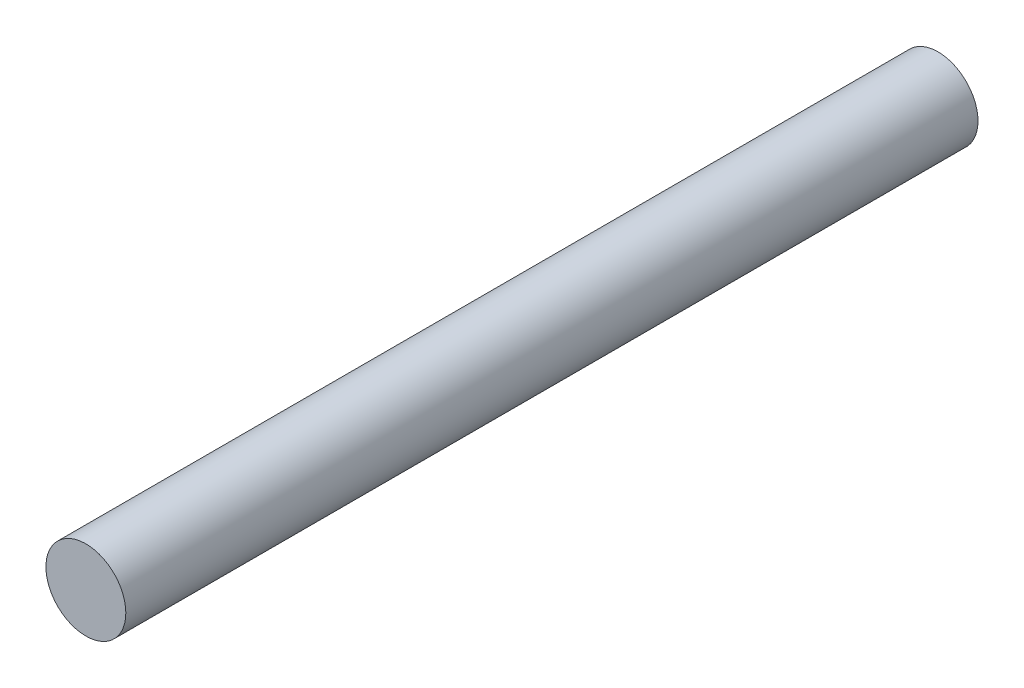
ISO-10303-21;
HEADER;
FILE_DESCRIPTION(('STEP AP214'),'2;1');
FILE_NAME('part.step','',(''),(''),'','','');
FILE_SCHEMA(('AUTOMOTIVE_DESIGN { 1 0 10303 214 1 1 1 1 }'));
ENDSEC;
DATA;
#1=APPLICATION_CONTEXT('core data for automotive mechanical design processes');
#2=APPLICATION_PROTOCOL_DEFINITION('international standard','automotive_design',2000,#1);
#3=PRODUCT_CONTEXT('',#1,'mechanical');
#4=PRODUCT('Part','Part','',(#3));
#5=PRODUCT_RELATED_PRODUCT_CATEGORY('part','',(#4));
#6=PRODUCT_DEFINITION_FORMATION('','',#4);
#7=PRODUCT_DEFINITION_CONTEXT('part definition',#1,'design');
#8=PRODUCT_DEFINITION('design','',#6,#7);
#9=PRODUCT_DEFINITION_SHAPE('','',#8);
#10=(LENGTH_UNIT() NAMED_UNIT(*) SI_UNIT(.MILLI.,.METRE.));
#11=(NAMED_UNIT(*) PLANE_ANGLE_UNIT() SI_UNIT($,.RADIAN.));
#12=(NAMED_UNIT(*) SI_UNIT($,.STERADIAN.) SOLID_ANGLE_UNIT());
#13=UNCERTAINTY_MEASURE_WITH_UNIT(LENGTH_MEASURE(1.E-05),#10,'distance_accuracy_value','');
#14=(GEOMETRIC_REPRESENTATION_CONTEXT(3) GLOBAL_UNCERTAINTY_ASSIGNED_CONTEXT((#13)) GLOBAL_UNIT_ASSIGNED_CONTEXT((#10,
#11,#12)) REPRESENTATION_CONTEXT('',''));
#15=CARTESIAN_POINT('',(0.,0.,0.));
#16=DIRECTION('',(0.,0.,1.));
#17=DIRECTION('',(1.,0.,0.));
#18=AXIS2_PLACEMENT_3D('',#15,#16,#17);
#19=CARTESIAN_POINT('',(0.,0.,-16.));
#20=DIRECTION('',(0.,0.,1.));
#21=DIRECTION('',(-1.,0.,0.));
#22=AXIS2_PLACEMENT_3D('',#19,#20,#21);
#23=CYLINDRICAL_SURFACE('',#22,0.75);
#24=CARTESIAN_POINT('',(0.,0.,-16.));
#25=DIRECTION('',(0.,0.,1.));
#26=DIRECTION('',(1.,0.,0.));
#27=AXIS2_PLACEMENT_3D('',#24,#25,#26);
#28=CIRCLE('',#27,0.75);
#29=CARTESIAN_POINT('',(0.75,0.,-16.));
#30=VERTEX_POINT('',#29);
#31=EDGE_CURVE('E10',#30,#30,#28,.T.);
#32=ORIENTED_EDGE('',*,*,#31,.T.);
#33=EDGE_LOOP('',(#32));
#34=FACE_BOUND('',#33,.T.);
#35=CARTESIAN_POINT('',(0.,0.,0.));
#36=DIRECTION('',(0.,0.,1.));
#37=DIRECTION('',(1.,0.,0.));
#38=AXIS2_PLACEMENT_3D('',#35,#36,#37);
#39=CIRCLE('',#38,0.75);
#40=CARTESIAN_POINT('',(0.75,0.,0.));
#41=VERTEX_POINT('',#40);
#42=EDGE_CURVE('E38',#41,#41,#39,.T.);
#43=ORIENTED_EDGE('',*,*,#42,.F.);
#44=EDGE_LOOP('',(#43));
#45=FACE_BOUND('',#44,.T.);
#46=ADVANCED_FACE('F35',(#34,#45),#23,.T.);
#47=CARTESIAN_POINT('',(0.,0.,-16.));
#48=DIRECTION('',(0.,0.,-1.));
#49=DIRECTION('',(1.,0.,0.));
#50=AXIS2_PLACEMENT_3D('',#47,#48,#49);
#51=PLANE('',#50);
#52=ORIENTED_EDGE('',*,*,#31,.F.);
#53=EDGE_LOOP('',(#52));
#54=FACE_BOUND('',#53,.T.);
#55=ADVANCED_FACE('F50',(#54),#51,.T.);
#56=CARTESIAN_POINT('',(0.,0.,0.));
#57=DIRECTION('',(0.,0.,-1.));
#58=DIRECTION('',(1.,0.,0.));
#59=AXIS2_PLACEMENT_3D('',#56,#57,#58);
#60=PLANE('',#59);
#61=ORIENTED_EDGE('',*,*,#42,.T.);
#62=EDGE_LOOP('',(#61));
#63=FACE_BOUND('',#62,.T.);
#64=ADVANCED_FACE('F47',(#63),#60,.F.);
#65=CLOSED_SHELL('',(#46,#55,#64));
#66=MANIFOLD_SOLID_BREP('B2',#65);
#67=ADVANCED_BREP_SHAPE_REPRESENTATION('',(#18,#66),#14);
#68=SHAPE_DEFINITION_REPRESENTATION(#9,#67);
ENDSEC;
END-ISO-10303-21;
